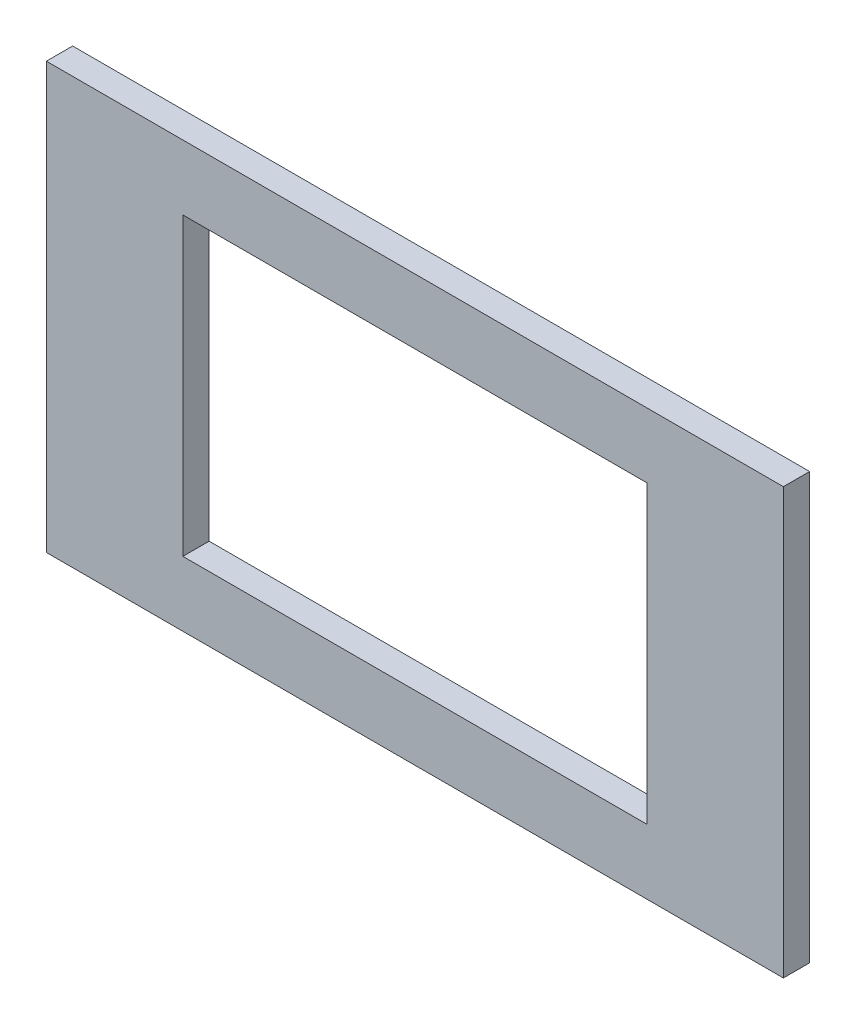
ISO-10303-21;
HEADER;
FILE_DESCRIPTION(('STEP AP214'),'2;1');
FILE_NAME('part.step','',(''),(''),'','','');
FILE_SCHEMA(('AUTOMOTIVE_DESIGN { 1 0 10303 214 1 1 1 1 }'));
ENDSEC;
DATA;
#1=APPLICATION_CONTEXT('core data for automotive mechanical design processes');
#2=APPLICATION_PROTOCOL_DEFINITION('international standard','automotive_design',2000,#1);
#3=PRODUCT_CONTEXT('',#1,'mechanical');
#4=PRODUCT('Part','Part','',(#3));
#5=PRODUCT_RELATED_PRODUCT_CATEGORY('part','',(#4));
#6=PRODUCT_DEFINITION_FORMATION('','',#4);
#7=PRODUCT_DEFINITION_CONTEXT('part definition',#1,'design');
#8=PRODUCT_DEFINITION('design','',#6,#7);
#9=PRODUCT_DEFINITION_SHAPE('','',#8);
#10=(LENGTH_UNIT() NAMED_UNIT(*) SI_UNIT(.MILLI.,.METRE.));
#11=(NAMED_UNIT(*) PLANE_ANGLE_UNIT() SI_UNIT($,.RADIAN.));
#12=(NAMED_UNIT(*) SI_UNIT($,.STERADIAN.) SOLID_ANGLE_UNIT());
#13=UNCERTAINTY_MEASURE_WITH_UNIT(LENGTH_MEASURE(1.E-05),#10,'distance_accuracy_value','');
#14=(GEOMETRIC_REPRESENTATION_CONTEXT(3) GLOBAL_UNCERTAINTY_ASSIGNED_CONTEXT((#13)) GLOBAL_UNIT_ASSIGNED_CONTEXT((#10,
#11,#12)) REPRESENTATION_CONTEXT('',''));
#15=CARTESIAN_POINT('',(0.,0.,0.));
#16=DIRECTION('',(0.,0.,1.));
#17=DIRECTION('',(1.,0.,0.));
#18=AXIS2_PLACEMENT_3D('',#15,#16,#17);
#19=CARTESIAN_POINT('',(0.,0.,5.));
#20=DIRECTION('',(0.,0.,1.));
#21=DIRECTION('',(1.,0.,0.));
#22=AXIS2_PLACEMENT_3D('',#19,#20,#21);
#23=PLANE('',#22);
#24=DIRECTION('',(0.,1.,0.));
#25=VECTOR('',#24,1.);
#26=CARTESIAN_POINT('',(70.1416962705252,40.4944305039976,5.));
#27=LINE('',#26,#25);
#28=CARTESIAN_POINT('',(70.1416962705252,-40.4944305039976,5.));
#29=VERTEX_POINT('',#28);
#30=CARTESIAN_POINT('',(70.1416962705252,40.4944305039976,5.));
#31=VERTEX_POINT('',#30);
#32=EDGE_CURVE('E153',#29,#31,#27,.T.);
#33=ORIENTED_EDGE('',*,*,#32,.T.);
#34=DIRECTION('',(-1.,0.,0.));
#35=VECTOR('',#34,1.);
#36=CARTESIAN_POINT('',(-70.1416962705252,40.4944305039976,5.));
#37=LINE('',#36,#35);
#38=CARTESIAN_POINT('',(-70.1416962705252,40.4944305039976,5.));
#39=VERTEX_POINT('',#38);
#40=EDGE_CURVE('E157',#31,#39,#37,.T.);
#41=ORIENTED_EDGE('',*,*,#40,.T.);
#42=DIRECTION('',(0.,-1.,0.));
#43=VECTOR('',#42,1.);
#44=CARTESIAN_POINT('',(-70.1416962705252,40.4944305039976,5.));
#45=LINE('',#44,#43);
#46=CARTESIAN_POINT('',(-70.1416962705252,-40.4944305039976,5.));
#47=VERTEX_POINT('',#46);
#48=EDGE_CURVE('E161',#39,#47,#45,.T.);
#49=ORIENTED_EDGE('',*,*,#48,.T.);
#50=DIRECTION('',(1.,0.,0.));
#51=VECTOR('',#50,1.);
#52=CARTESIAN_POINT('',(-70.1416962705252,-40.4944305039976,5.));
#53=LINE('',#52,#51);
#54=EDGE_CURVE('E164',#47,#29,#53,.T.);
#55=ORIENTED_EDGE('',*,*,#54,.T.);
#56=EDGE_LOOP('',(#33,#41,#49,#55));
#57=FACE_BOUND('',#56,.T.);
#58=DIRECTION('',(-1.,0.,0.));
#59=VECTOR('',#58,1.);
#60=CARTESIAN_POINT('',(-44.1591266212527,28.141575326174,5.));
#61=LINE('',#60,#59);
#62=CARTESIAN_POINT('',(44.1591266212527,28.141575326174,5.));
#63=VERTEX_POINT('',#62);
#64=CARTESIAN_POINT('',(-44.1591266212527,28.141575326174,5.));
#65=VERTEX_POINT('',#64);
#66=EDGE_CURVE('E114',#63,#65,#61,.T.);
#67=ORIENTED_EDGE('',*,*,#66,.F.);
#68=DIRECTION('',(0.,1.,0.));
#69=VECTOR('',#68,1.);
#70=CARTESIAN_POINT('',(44.1591266212527,28.141575326174,5.));
#71=LINE('',#70,#69);
#72=CARTESIAN_POINT('',(44.1591266212527,-28.141575326174,5.));
#73=VERTEX_POINT('',#72);
#74=EDGE_CURVE('E105',#73,#63,#71,.T.);
#75=ORIENTED_EDGE('',*,*,#74,.F.);
#76=DIRECTION('',(1.,0.,0.));
#77=VECTOR('',#76,1.);
#78=CARTESIAN_POINT('',(-44.1591266212527,-28.141575326174,5.));
#79=LINE('',#78,#77);
#80=CARTESIAN_POINT('',(-44.1591266212527,-28.141575326174,5.));
#81=VERTEX_POINT('',#80);
#82=EDGE_CURVE('E131',#81,#73,#79,.T.);
#83=ORIENTED_EDGE('',*,*,#82,.F.);
#84=DIRECTION('',(0.,-1.,0.));
#85=VECTOR('',#84,1.);
#86=CARTESIAN_POINT('',(-44.1591266212527,28.141575326174,5.));
#87=LINE('',#86,#85);
#88=EDGE_CURVE('E127',#65,#81,#87,.T.);
#89=ORIENTED_EDGE('',*,*,#88,.F.);
#90=EDGE_LOOP('',(#67,#75,#83,#89));
#91=FACE_BOUND('',#90,.T.);
#92=ADVANCED_FACE('F39',(#57,#91),#23,.T.);
#93=CARTESIAN_POINT('',(0.,0.,0.));
#94=DIRECTION('',(0.,0.,1.));
#95=DIRECTION('',(1.,0.,0.));
#96=AXIS2_PLACEMENT_3D('',#93,#94,#95);
#97=PLANE('',#96);
#98=DIRECTION('',(0.,1.,0.));
#99=VECTOR('',#98,1.);
#100=CARTESIAN_POINT('',(70.1416962705252,40.4944305039976,0.));
#101=LINE('',#100,#99);
#102=CARTESIAN_POINT('',(70.1416962705252,-40.4944305039976,0.));
#103=VERTEX_POINT('',#102);
#104=CARTESIAN_POINT('',(70.1416962705252,40.4944305039976,0.));
#105=VERTEX_POINT('',#104);
#106=EDGE_CURVE('E123',#103,#105,#101,.T.);
#107=ORIENTED_EDGE('',*,*,#106,.F.);
#108=DIRECTION('',(1.,0.,0.));
#109=VECTOR('',#108,1.);
#110=CARTESIAN_POINT('',(-70.1416962705252,-40.4944305039976,0.));
#111=LINE('',#110,#109);
#112=CARTESIAN_POINT('',(-70.1416962705252,-40.4944305039976,0.));
#113=VERTEX_POINT('',#112);
#114=EDGE_CURVE('E158',#113,#103,#111,.T.);
#115=ORIENTED_EDGE('',*,*,#114,.F.);
#116=DIRECTION('',(0.,-1.,0.));
#117=VECTOR('',#116,1.);
#118=CARTESIAN_POINT('',(-70.1416962705252,40.4944305039976,0.));
#119=LINE('',#118,#117);
#120=CARTESIAN_POINT('',(-70.1416962705252,40.4944305039976,0.));
#121=VERTEX_POINT('',#120);
#122=EDGE_CURVE('E174',#121,#113,#119,.T.);
#123=ORIENTED_EDGE('',*,*,#122,.F.);
#124=DIRECTION('',(-1.,0.,0.));
#125=VECTOR('',#124,1.);
#126=CARTESIAN_POINT('',(-70.1416962705252,40.4944305039976,0.));
#127=LINE('',#126,#125);
#128=EDGE_CURVE('E171',#105,#121,#127,.T.);
#129=ORIENTED_EDGE('',*,*,#128,.F.);
#130=EDGE_LOOP('',(#107,#115,#123,#129));
#131=FACE_BOUND('',#130,.T.);
#132=DIRECTION('',(0.,1.,0.));
#133=VECTOR('',#132,1.);
#134=CARTESIAN_POINT('',(44.1591266212527,28.141575326174,0.));
#135=LINE('',#134,#133);
#136=CARTESIAN_POINT('',(44.1591266212527,-28.141575326174,0.));
#137=VERTEX_POINT('',#136);
#138=CARTESIAN_POINT('',(44.1591266212527,28.141575326174,0.));
#139=VERTEX_POINT('',#138);
#140=EDGE_CURVE('E63',#137,#139,#135,.T.);
#141=ORIENTED_EDGE('',*,*,#140,.T.);
#142=DIRECTION('',(-1.,0.,0.));
#143=VECTOR('',#142,1.);
#144=CARTESIAN_POINT('',(-44.1591266212527,28.141575326174,0.));
#145=LINE('',#144,#143);
#146=CARTESIAN_POINT('',(-44.1591266212527,28.141575326174,0.));
#147=VERTEX_POINT('',#146);
#148=EDGE_CURVE('E121',#139,#147,#145,.T.);
#149=ORIENTED_EDGE('',*,*,#148,.T.);
#150=DIRECTION('',(0.,-1.,0.));
#151=VECTOR('',#150,1.);
#152=CARTESIAN_POINT('',(-44.1591266212527,28.141575326174,0.));
#153=LINE('',#152,#151);
#154=CARTESIAN_POINT('',(-44.1591266212527,-28.141575326174,0.));
#155=VERTEX_POINT('',#154);
#156=EDGE_CURVE('E140',#147,#155,#153,.T.);
#157=ORIENTED_EDGE('',*,*,#156,.T.);
#158=DIRECTION('',(1.,0.,0.));
#159=VECTOR('',#158,1.);
#160=CARTESIAN_POINT('',(-44.1591266212527,-28.141575326174,0.));
#161=LINE('',#160,#159);
#162=EDGE_CURVE('E115',#155,#137,#161,.T.);
#163=ORIENTED_EDGE('',*,*,#162,.T.);
#164=EDGE_LOOP('',(#141,#149,#157,#163));
#165=FACE_BOUND('',#164,.T.);
#166=ADVANCED_FACE('F197',(#131,#165),#97,.F.);
#167=CARTESIAN_POINT('',(70.1416962705252,40.4944305039976,5.));
#168=DIRECTION('',(-1.,0.,0.));
#169=DIRECTION('',(0.,0.,1.));
#170=AXIS2_PLACEMENT_3D('',#167,#168,#169);
#171=PLANE('',#170);
#172=ORIENTED_EDGE('',*,*,#106,.T.);
#173=DIRECTION('',(0.,0.,-1.));
#174=VECTOR('',#173,1.);
#175=CARTESIAN_POINT('',(70.1416962705252,40.4944305039976,5.));
#176=LINE('',#175,#174);
#177=EDGE_CURVE('E11',#31,#105,#176,.T.);
#178=ORIENTED_EDGE('',*,*,#177,.F.);
#179=ORIENTED_EDGE('',*,*,#32,.F.);
#180=DIRECTION('',(0.,0.,-1.));
#181=VECTOR('',#180,1.);
#182=CARTESIAN_POINT('',(70.1416962705252,-40.4944305039976,5.));
#183=LINE('',#182,#181);
#184=EDGE_CURVE('E167',#29,#103,#183,.T.);
#185=ORIENTED_EDGE('',*,*,#184,.T.);
#186=EDGE_LOOP('',(#172,#178,#179,#185));
#187=FACE_BOUND('',#186,.T.);
#188=ADVANCED_FACE('F41',(#187),#171,.F.);
#189=CARTESIAN_POINT('',(-70.1416962705252,40.4944305039976,5.));
#190=DIRECTION('',(0.,-1.,0.));
#191=DIRECTION('',(0.,0.,-1.));
#192=AXIS2_PLACEMENT_3D('',#189,#190,#191);
#193=PLANE('',#192);
#194=ORIENTED_EDGE('',*,*,#128,.T.);
#195=DIRECTION('',(0.,0.,-1.));
#196=VECTOR('',#195,1.);
#197=CARTESIAN_POINT('',(-70.1416962705252,40.4944305039976,5.));
#198=LINE('',#197,#196);
#199=EDGE_CURVE('E48',#39,#121,#198,.T.);
#200=ORIENTED_EDGE('',*,*,#199,.F.);
#201=ORIENTED_EDGE('',*,*,#40,.F.);
#202=ORIENTED_EDGE('',*,*,#177,.T.);
#203=EDGE_LOOP('',(#194,#200,#201,#202));
#204=FACE_BOUND('',#203,.T.);
#205=ADVANCED_FACE('F207',(#204),#193,.F.);
#206=CARTESIAN_POINT('',(-70.1416962705252,40.4944305039976,5.));
#207=DIRECTION('',(1.,0.,0.));
#208=DIRECTION('',(0.,0.,-1.));
#209=AXIS2_PLACEMENT_3D('',#206,#207,#208);
#210=PLANE('',#209);
#211=ORIENTED_EDGE('',*,*,#122,.T.);
#212=DIRECTION('',(0.,0.,-1.));
#213=VECTOR('',#212,1.);
#214=CARTESIAN_POINT('',(-70.1416962705252,-40.4944305039976,5.));
#215=LINE('',#214,#213);
#216=EDGE_CURVE('E182',#47,#113,#215,.T.);
#217=ORIENTED_EDGE('',*,*,#216,.F.);
#218=ORIENTED_EDGE('',*,*,#48,.F.);
#219=ORIENTED_EDGE('',*,*,#199,.T.);
#220=EDGE_LOOP('',(#211,#217,#218,#219));
#221=FACE_BOUND('',#220,.T.);
#222=ADVANCED_FACE('F191',(#221),#210,.F.);
#223=CARTESIAN_POINT('',(-70.1416962705252,-40.4944305039976,5.));
#224=DIRECTION('',(0.,1.,0.));
#225=DIRECTION('',(0.,0.,1.));
#226=AXIS2_PLACEMENT_3D('',#223,#224,#225);
#227=PLANE('',#226);
#228=ORIENTED_EDGE('',*,*,#114,.T.);
#229=ORIENTED_EDGE('',*,*,#184,.F.);
#230=ORIENTED_EDGE('',*,*,#54,.F.);
#231=ORIENTED_EDGE('',*,*,#216,.T.);
#232=EDGE_LOOP('',(#228,#229,#230,#231));
#233=FACE_BOUND('',#232,.T.);
#234=ADVANCED_FACE('F201',(#233),#227,.F.);
#235=CARTESIAN_POINT('',(44.1591266212527,28.141575326174,5.));
#236=DIRECTION('',(-1.,0.,0.));
#237=DIRECTION('',(0.,0.,1.));
#238=AXIS2_PLACEMENT_3D('',#235,#236,#237);
#239=PLANE('',#238);
#240=ORIENTED_EDGE('',*,*,#140,.F.);
#241=DIRECTION('',(0.,0.,-1.));
#242=VECTOR('',#241,1.);
#243=CARTESIAN_POINT('',(44.1591266212527,-28.141575326174,5.));
#244=LINE('',#243,#242);
#245=EDGE_CURVE('E109',#73,#137,#244,.T.);
#246=ORIENTED_EDGE('',*,*,#245,.F.);
#247=ORIENTED_EDGE('',*,*,#74,.T.);
#248=DIRECTION('',(0.,0.,-1.));
#249=VECTOR('',#248,1.);
#250=CARTESIAN_POINT('',(44.1591266212527,28.141575326174,5.));
#251=LINE('',#250,#249);
#252=EDGE_CURVE('E108',#63,#139,#251,.T.);
#253=ORIENTED_EDGE('',*,*,#252,.T.);
#254=EDGE_LOOP('',(#240,#246,#247,#253));
#255=FACE_BOUND('',#254,.T.);
#256=ADVANCED_FACE('F107',(#255),#239,.T.);
#257=CARTESIAN_POINT('',(-44.1591266212527,28.141575326174,5.));
#258=DIRECTION('',(0.,-1.,0.));
#259=DIRECTION('',(0.,0.,-1.));
#260=AXIS2_PLACEMENT_3D('',#257,#258,#259);
#261=PLANE('',#260);
#262=ORIENTED_EDGE('',*,*,#148,.F.);
#263=ORIENTED_EDGE('',*,*,#252,.F.);
#264=ORIENTED_EDGE('',*,*,#66,.T.);
#265=DIRECTION('',(0.,0.,-1.));
#266=VECTOR('',#265,1.);
#267=CARTESIAN_POINT('',(-44.1591266212527,28.141575326174,5.));
#268=LINE('',#267,#266);
#269=EDGE_CURVE('E124',#65,#147,#268,.T.);
#270=ORIENTED_EDGE('',*,*,#269,.T.);
#271=EDGE_LOOP('',(#262,#263,#264,#270));
#272=FACE_BOUND('',#271,.T.);
#273=ADVANCED_FACE('F118',(#272),#261,.T.);
#274=CARTESIAN_POINT('',(-44.1591266212527,28.141575326174,5.));
#275=DIRECTION('',(1.,0.,0.));
#276=DIRECTION('',(0.,0.,-1.));
#277=AXIS2_PLACEMENT_3D('',#274,#275,#276);
#278=PLANE('',#277);
#279=ORIENTED_EDGE('',*,*,#156,.F.);
#280=ORIENTED_EDGE('',*,*,#269,.F.);
#281=ORIENTED_EDGE('',*,*,#88,.T.);
#282=DIRECTION('',(0.,0.,-1.));
#283=VECTOR('',#282,1.);
#284=CARTESIAN_POINT('',(-44.1591266212527,-28.141575326174,5.));
#285=LINE('',#284,#283);
#286=EDGE_CURVE('E55',#81,#155,#285,.T.);
#287=ORIENTED_EDGE('',*,*,#286,.T.);
#288=EDGE_LOOP('',(#279,#280,#281,#287));
#289=FACE_BOUND('',#288,.T.);
#290=ADVANCED_FACE('F230',(#289),#278,.T.);
#291=CARTESIAN_POINT('',(-44.1591266212527,-28.141575326174,5.));
#292=DIRECTION('',(0.,1.,0.));
#293=DIRECTION('',(0.,0.,1.));
#294=AXIS2_PLACEMENT_3D('',#291,#292,#293);
#295=PLANE('',#294);
#296=ORIENTED_EDGE('',*,*,#162,.F.);
#297=ORIENTED_EDGE('',*,*,#286,.F.);
#298=ORIENTED_EDGE('',*,*,#82,.T.);
#299=ORIENTED_EDGE('',*,*,#245,.T.);
#300=EDGE_LOOP('',(#296,#297,#298,#299));
#301=FACE_BOUND('',#300,.T.);
#302=ADVANCED_FACE('F234',(#301),#295,.T.);
#303=CLOSED_SHELL('',(#92,#166,#188,#205,#222,#234,#256,#273,#290,#302));
#304=MANIFOLD_SOLID_BREP('B2',#303);
#305=ADVANCED_BREP_SHAPE_REPRESENTATION('',(#18,#304),#14);
#306=SHAPE_DEFINITION_REPRESENTATION(#9,#305);
ENDSEC;
END-ISO-10303-21;
